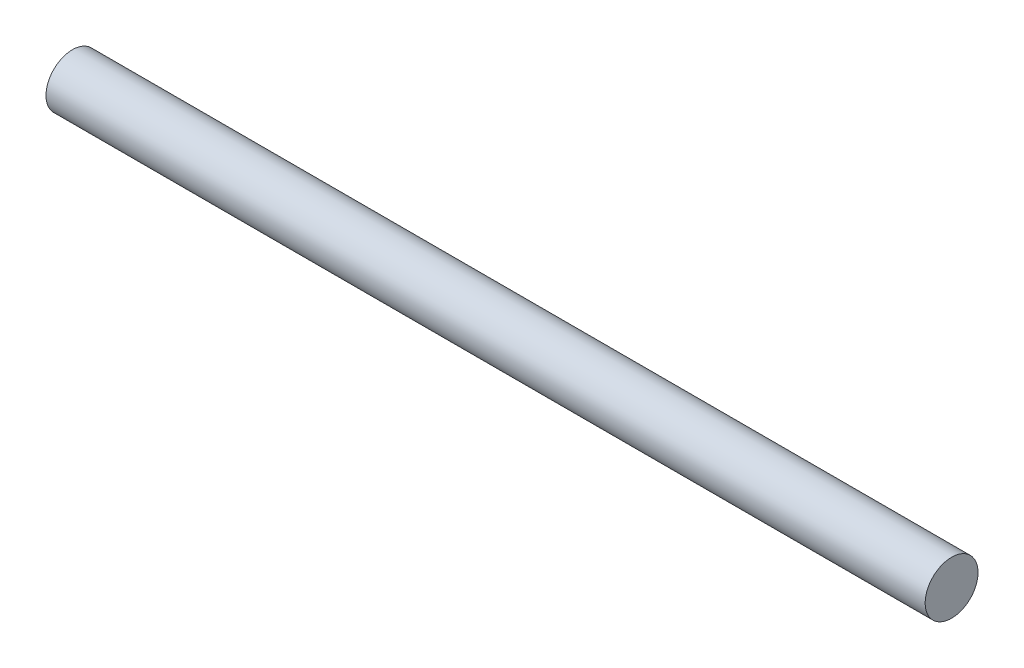
ISO-10303-21;
HEADER;
FILE_DESCRIPTION(('STEP AP214'),'2;1');
FILE_NAME('part.step','',(''),(''),'','','');
FILE_SCHEMA(('AUTOMOTIVE_DESIGN { 1 0 10303 214 1 1 1 1 }'));
ENDSEC;
DATA;
#1=APPLICATION_CONTEXT('core data for automotive mechanical design processes');
#2=APPLICATION_PROTOCOL_DEFINITION('international standard','automotive_design',2000,#1);
#3=PRODUCT_CONTEXT('',#1,'mechanical');
#4=PRODUCT('Part','Part','',(#3));
#5=PRODUCT_RELATED_PRODUCT_CATEGORY('part','',(#4));
#6=PRODUCT_DEFINITION_FORMATION('','',#4);
#7=PRODUCT_DEFINITION_CONTEXT('part definition',#1,'design');
#8=PRODUCT_DEFINITION('design','',#6,#7);
#9=PRODUCT_DEFINITION_SHAPE('','',#8);
#10=(LENGTH_UNIT() NAMED_UNIT(*) SI_UNIT(.MILLI.,.METRE.));
#11=(NAMED_UNIT(*) PLANE_ANGLE_UNIT() SI_UNIT($,.RADIAN.));
#12=(NAMED_UNIT(*) SI_UNIT($,.STERADIAN.) SOLID_ANGLE_UNIT());
#13=UNCERTAINTY_MEASURE_WITH_UNIT(LENGTH_MEASURE(1.E-05),#10,'distance_accuracy_value','');
#14=(GEOMETRIC_REPRESENTATION_CONTEXT(3) GLOBAL_UNCERTAINTY_ASSIGNED_CONTEXT((#13)) GLOBAL_UNIT_ASSIGNED_CONTEXT((#10,
#11,#12)) REPRESENTATION_CONTEXT('',''));
#15=CARTESIAN_POINT('',(0.,0.,0.));
#16=DIRECTION('',(0.,0.,1.));
#17=DIRECTION('',(1.,0.,0.));
#18=AXIS2_PLACEMENT_3D('',#15,#16,#17);
#19=CARTESIAN_POINT('',(-213.489347611488,322.361927831196,-613.95));
#20=DIRECTION('',(0.,-1.,0.));
#21=DIRECTION('',(0.,0.,-1.));
#22=AXIS2_PLACEMENT_3D('',#19,#20,#21);
#23=CONICAL_SURFACE('',#22,5.09999999995869,1.02974425865526);
#24=CARTESIAN_POINT('',(-213.489347611488,325.426316988228,-613.949999999988));
#25=VERTEX_POINT('',#24);
#26=VERTEX_LOOP('',#25);
#27=FACE_BOUND('',#26,.T.);
#28=CARTESIAN_POINT('',(-213.489347611488,322.361927831158,-613.95));
#29=DIRECTION('',(0.,-1.,0.));
#30=DIRECTION('',(0.,0.,-1.));
#31=AXIS2_PLACEMENT_3D('',#28,#29,#30);
#32=CIRCLE('',#31,5.1);
#33=CARTESIAN_POINT('',(-213.489347611488,322.361927831158,-619.05));
#34=VERTEX_POINT('',#33);
#35=EDGE_CURVE('E41',#34,#34,#32,.T.);
#36=ORIENTED_EDGE('',*,*,#35,.T.);
#37=EDGE_LOOP('',(#36));
#38=FACE_BOUND('',#37,.T.);
#39=ADVANCED_FACE('F17',(#27,#38),#23,.F.);
#40=CARTESIAN_POINT('',(-133.489347611488,322.361927831196,-613.95));
#41=DIRECTION('',(0.,-1.,0.));
#42=DIRECTION('',(0.,0.,-1.));
#43=AXIS2_PLACEMENT_3D('',#40,#41,#42);
#44=CONICAL_SURFACE('',#43,5.09999999995869,1.02974425865526);
#45=CARTESIAN_POINT('',(-133.489347611488,325.426316988228,-613.949999999988));
#46=VERTEX_POINT('',#45);
#47=VERTEX_LOOP('',#46);
#48=FACE_BOUND('',#47,.T.);
#49=CARTESIAN_POINT('',(-133.489347611488,322.361927831158,-613.95));
#50=DIRECTION('',(0.,-1.,0.));
#51=DIRECTION('',(0.,0.,-1.));
#52=AXIS2_PLACEMENT_3D('',#49,#50,#51);
#53=CIRCLE('',#52,5.1);
#54=CARTESIAN_POINT('',(-133.489347611488,322.361927831158,-619.05));
#55=VERTEX_POINT('',#54);
#56=EDGE_CURVE('E43',#55,#55,#53,.T.);
#57=ORIENTED_EDGE('',*,*,#56,.T.);
#58=EDGE_LOOP('',(#57));
#59=FACE_BOUND('',#58,.T.);
#60=ADVANCED_FACE('F38',(#48,#59),#44,.F.);
#61=CARTESIAN_POINT('',(-213.489347611488,291.861927831158,-613.95));
#62=DIRECTION('',(0.,-1.,0.));
#63=DIRECTION('',(0.,0.,-1.));
#64=AXIS2_PLACEMENT_3D('',#61,#62,#63);
#65=CYLINDRICAL_SURFACE('',#64,5.1);
#66=ORIENTED_EDGE('',*,*,#35,.F.);
#67=EDGE_LOOP('',(#66));
#68=FACE_BOUND('',#67,.T.);
#69=CARTESIAN_POINT('',(-213.489347611488,292.220491410964,-608.85));
#70=CARTESIAN_POINT('',(-213.346939032654,292.220491132857,-608.850000743828));
#71=CARTESIAN_POINT('',(-213.204508703072,292.219646252261,-608.855969794335));
#72=CARTESIAN_POINT('',(-212.920611238575,292.21628976674,-608.879808186821));
#73=CARTESIAN_POINT('',(-212.779144591536,292.213777373007,-608.897683160847));
#74=CARTESIAN_POINT('',(-212.498007184461,292.207152713141,-608.945242217478));
#75=CARTESIAN_POINT('',(-212.358339745417,292.203037833321,-608.97494559425));
#76=CARTESIAN_POINT('',(-212.081982992976,292.193325522824,-609.045951960026));
#77=CARTESIAN_POINT('',(-211.945294828178,292.187727530935,-609.087259340373));
#78=CARTESIAN_POINT('',(-211.676120232044,292.175220486331,-609.18109127047));
#79=CARTESIAN_POINT('',(-211.543627738757,292.168313436248,-609.233598701283));
#80=CARTESIAN_POINT('',(-211.28350419562,292.153377069012,-609.349506844893));
#81=CARTESIAN_POINT('',(-211.155874960489,292.14534733805,-609.4129115763));
#82=CARTESIAN_POINT('',(-210.906510242832,292.128401865254,-609.550092518883));
#83=CARTESIAN_POINT('',(-210.78477024694,292.119486818431,-609.623860612961));
#84=CARTESIAN_POINT('',(-210.54786914658,292.101012845346,-609.781314281504));
#85=CARTESIAN_POINT('',(-210.432710504348,292.091453680984,-609.865003532164));
#86=CARTESIAN_POINT('',(-210.209141969366,292.071903656039,-610.04222318872));
#87=CARTESIAN_POINT('',(-210.100776507755,292.061910557492,-610.13580940354));
#88=CARTESIAN_POINT('',(-209.892260859676,292.041824475064,-610.331789616415));
#89=CARTESIAN_POINT('',(-209.792113728006,292.03173145559,-610.434186860865));
#90=CARTESIAN_POINT('',(-209.600800284167,292.011735683318,-610.647021206297));
#91=CARTESIAN_POINT('',(-209.509631606474,292.001832880959,-610.757456176199));
#92=CARTESIAN_POINT('',(-209.336851322405,291.982489227453,-610.985667732249));
#93=CARTESIAN_POINT('',(-209.255243253353,291.973048548033,-611.103447011172));
#94=CARTESIAN_POINT('',(-209.101911128928,291.954863966583,-611.345953589095));
#95=CARTESIAN_POINT('',(-209.030225676614,291.946122838783,-611.470705512243));
#96=CARTESIAN_POINT('',(-208.897600669893,291.929622058634,-611.725915639935));
#97=CARTESIAN_POINT('',(-208.836665120865,291.92186277242,-611.856375948905));
#98=CARTESIAN_POINT('',(-208.726043310313,291.907553644554,-612.121992662409));
#99=CARTESIAN_POINT('',(-208.676352362161,291.901003299239,-612.257147083294));
#100=CARTESIAN_POINT('',(-208.588544550413,291.889291336036,-612.531242014267));
#101=CARTESIAN_POINT('',(-208.550431988518,291.884130234373,-612.670183910669));
#102=CARTESIAN_POINT('',(-208.454402194121,291.871031353773,-613.089237433029));
#103=CARTESIAN_POINT('',(-208.413941369337,291.865364138892,-613.373629313614));
#104=CARTESIAN_POINT('',(-208.381323222481,291.86080808865,-613.945216162223));
#105=CARTESIAN_POINT('',(-208.389163630934,291.861918934816,-614.232410997915));
#106=CARTESIAN_POINT('',(-208.436703861206,291.868525544821,-614.657858308054));
#107=CARTESIAN_POINT('',(-208.458396166471,291.871534843425,-614.798371061319));
#108=CARTESIAN_POINT('',(-208.513413854514,291.879090861733,-615.077039928221));
#109=CARTESIAN_POINT('',(-208.546734885619,291.883637006303,-615.215196903176));
#110=CARTESIAN_POINT('',(-208.624783215857,291.894144586066,-615.488243290287));
#111=CARTESIAN_POINT('',(-208.669514961021,291.90010657286,-615.623131406293));
#112=CARTESIAN_POINT('',(-208.7700323976,291.913276052463,-615.888607513765));
#113=CARTESIAN_POINT('',(-208.825814124591,291.92048309846,-616.019197027912));
#114=CARTESIAN_POINT('',(-208.948267825548,291.935973441252,-616.275697144089));
#115=CARTESIAN_POINT('',(-209.014979511339,291.944260639235,-616.401588548499));
#116=CARTESIAN_POINT('',(-209.158642839636,291.961656520715,-616.647264889052));
#117=CARTESIAN_POINT('',(-209.235590798047,291.970764908283,-616.767052000814));
#118=CARTESIAN_POINT('',(-209.399231404228,291.989556080981,-616.999785564408));
#119=CARTESIAN_POINT('',(-209.485927274235,291.999239055544,-617.112729735163));
#120=CARTESIAN_POINT('',(-209.668407434396,292.018904432692,-617.330922344829));
#121=CARTESIAN_POINT('',(-209.764188447947,292.028886726446,-617.436173534188));
#122=CARTESIAN_POINT('',(-209.965083067759,292.048964721996,-617.639191087572));
#123=CARTESIAN_POINT('',(-210.070271027063,292.059060651633,-617.736883869296));
#124=CARTESIAN_POINT('',(-210.288479739446,292.078989449684,-617.923034648054));
#125=CARTESIAN_POINT('',(-210.401497623173,292.088822412653,-618.011495998564));
#126=CARTESIAN_POINT('',(-210.634712483843,292.107957941799,-618.178671108343));
#127=CARTESIAN_POINT('',(-210.754915348373,292.117260060441,-618.257376706554));
#128=CARTESIAN_POINT('',(-211.001529791299,292.135055739233,-618.404364220365));
#129=CARTESIAN_POINT('',(-211.127939019263,292.143549601954,-618.472650042435));
#130=CARTESIAN_POINT('',(-211.386355835781,292.159503010257,-618.598452913198));
#131=CARTESIAN_POINT('',(-211.518373178015,292.166960648692,-618.655950172163));
#132=CARTESIAN_POINT('',(-211.786803336076,292.180603984917,-618.759577154227));
#133=CARTESIAN_POINT('',(-211.923214444558,292.186790170038,-618.805711234023));
#134=CARTESIAN_POINT('',(-212.199266183141,292.197704204893,-618.886226175794));
#135=CARTESIAN_POINT('',(-212.338900972354,292.202434498973,-618.920626748179));
#136=CARTESIAN_POINT('',(-212.620563885835,292.210310275209,-618.977508515158));
#137=CARTESIAN_POINT('',(-212.76259081631,292.213456524999,-618.999995483405));
#138=CARTESIAN_POINT('',(-213.002215417039,292.217334274338,-619.027619938099));
#139=CARTESIAN_POINT('',(-213.099443210982,292.218516691242,-619.036009345952));
#140=CARTESIAN_POINT('',(-213.294226470552,292.220095355052,-619.047199633336));
#141=CARTESIAN_POINT('',(-213.391781936369,292.220491601498,-619.050000509605));
#142=CARTESIAN_POINT('',(-213.631756190322,292.220491132857,-619.049999256172));
#143=CARTESIAN_POINT('',(-213.774186519904,292.219646252261,-619.044030205665));
#144=CARTESIAN_POINT('',(-214.058083984401,292.21628976674,-619.020191813179));
#145=CARTESIAN_POINT('',(-214.19955063144,292.213777373007,-619.002316839153));
#146=CARTESIAN_POINT('',(-214.480688038515,292.207152713141,-618.954757782522));
#147=CARTESIAN_POINT('',(-214.620355477559,292.203037833321,-618.92505440575));
#148=CARTESIAN_POINT('',(-214.89671223,292.193325522824,-618.854048039974));
#149=CARTESIAN_POINT('',(-215.033400394798,292.187727530935,-618.812740659627));
#150=CARTESIAN_POINT('',(-215.302574990932,292.175220486331,-618.718908729531));
#151=CARTESIAN_POINT('',(-215.435067484219,292.168313436248,-618.666401298717));
#152=CARTESIAN_POINT('',(-215.695191027356,292.153377069012,-618.550493155107));
#153=CARTESIAN_POINT('',(-215.822820262487,292.14534733805,-618.4870884237));
#154=CARTESIAN_POINT('',(-216.072184980144,292.128401865254,-618.349907481117));
#155=CARTESIAN_POINT('',(-216.193924976036,292.119486818431,-618.276139387039));
#156=CARTESIAN_POINT('',(-216.430826076395,292.101012845346,-618.118685718496));
#157=CARTESIAN_POINT('',(-216.545984718628,292.091453680984,-618.034996467836));
#158=CARTESIAN_POINT('',(-216.76955325361,292.071903656039,-617.857776811281));
#159=CARTESIAN_POINT('',(-216.877918715221,292.061910557492,-617.76419059646));
#160=CARTESIAN_POINT('',(-217.0864343633,292.041824475064,-617.568210383585));
#161=CARTESIAN_POINT('',(-217.18658149497,292.03173145559,-617.465813139136));
#162=CARTESIAN_POINT('',(-217.377894938809,292.011735683318,-617.252978793704));
#163=CARTESIAN_POINT('',(-217.469063616502,292.001832880959,-617.142543823801));
#164=CARTESIAN_POINT('',(-217.641843900571,291.982489227453,-616.914332267752));
#165=CARTESIAN_POINT('',(-217.723451969623,291.973048548033,-616.796552988829));
#166=CARTESIAN_POINT('',(-217.876784094048,291.954863966583,-616.554046410905));
#167=CARTESIAN_POINT('',(-217.948469546362,291.946122838783,-616.429294487757));
#168=CARTESIAN_POINT('',(-218.081094553083,291.929622058634,-616.174084360065));
#169=CARTESIAN_POINT('',(-218.142030102111,291.92186277242,-616.043624051095));
#170=CARTESIAN_POINT('',(-218.252651912662,291.907553644554,-615.778007337592));
#171=CARTESIAN_POINT('',(-218.302342860815,291.901003299239,-615.642852916706));
#172=CARTESIAN_POINT('',(-218.390150672563,291.889291336036,-615.368757985734));
#173=CARTESIAN_POINT('',(-218.428263234458,291.884130234373,-615.229816089331));
#174=CARTESIAN_POINT('',(-218.524293028855,291.871031353773,-614.810762566971));
#175=CARTESIAN_POINT('',(-218.564753853639,291.865364138892,-614.526370686386));
#176=CARTESIAN_POINT('',(-218.597372000495,291.86080808865,-613.954783837777));
#177=CARTESIAN_POINT('',(-218.589531592042,291.861918934816,-613.667589002085));
#178=CARTESIAN_POINT('',(-218.54199136177,291.868525544821,-613.242141691946));
#179=CARTESIAN_POINT('',(-218.520299056505,291.871534843425,-613.101628938681));
#180=CARTESIAN_POINT('',(-218.465281368462,291.879090861733,-612.822960071779));
#181=CARTESIAN_POINT('',(-218.431960337357,291.883637006303,-612.684803096824));
#182=CARTESIAN_POINT('',(-218.353912007118,291.894144586066,-612.411756709713));
#183=CARTESIAN_POINT('',(-218.309180261955,291.90010657286,-612.276868593707));
#184=CARTESIAN_POINT('',(-218.208662825376,291.913276052463,-612.011392486235));
#185=CARTESIAN_POINT('',(-218.152881098385,291.92048309846,-611.880802972088));
#186=CARTESIAN_POINT('',(-218.030427397428,291.935973441252,-611.624302855912));
#187=CARTESIAN_POINT('',(-217.963715711637,291.944260639235,-611.498411451501));
#188=CARTESIAN_POINT('',(-217.82005238334,291.961656520715,-611.252735110948));
#189=CARTESIAN_POINT('',(-217.743104424929,291.970764908283,-611.132947999186));
#190=CARTESIAN_POINT('',(-217.579463818748,291.989556080981,-610.900214435592));
#191=CARTESIAN_POINT('',(-217.492767948741,291.999239055544,-610.787270264837));
#192=CARTESIAN_POINT('',(-217.310287788579,292.018904432692,-610.569077655171));
#193=CARTESIAN_POINT('',(-217.214506775029,292.028886726446,-610.463826465812));
#194=CARTESIAN_POINT('',(-217.013612155217,292.048964721996,-610.260808912429));
#195=CARTESIAN_POINT('',(-216.908424195913,292.059060651633,-610.163116130704));
#196=CARTESIAN_POINT('',(-216.69021548353,292.078989449684,-609.976965351946));
#197=CARTESIAN_POINT('',(-216.577197599803,292.088822412653,-609.888504001437));
#198=CARTESIAN_POINT('',(-216.343982739133,292.107957941799,-609.721328891657));
#199=CARTESIAN_POINT('',(-216.223779874603,292.117260060441,-609.642623293446));
#200=CARTESIAN_POINT('',(-215.977165431677,292.135055739233,-609.495635779635));
#201=CARTESIAN_POINT('',(-215.850756203713,292.143549601954,-609.427349957565));
#202=CARTESIAN_POINT('',(-215.592339387195,292.159503010257,-609.301547086802));
#203=CARTESIAN_POINT('',(-215.460322044961,292.166960648692,-609.244049827837));
#204=CARTESIAN_POINT('',(-215.1918918869,292.180603984917,-609.140422845773));
#205=CARTESIAN_POINT('',(-215.055480778418,292.186790170038,-609.094288765977));
#206=CARTESIAN_POINT('',(-214.779429039835,292.197704204893,-609.013773824206));
#207=CARTESIAN_POINT('',(-214.639794250622,292.202434498973,-608.979373251821));
#208=CARTESIAN_POINT('',(-214.358131337141,292.210310275209,-608.922491484843));
#209=CARTESIAN_POINT('',(-214.216104406666,292.213456524999,-608.900004516595));
#210=CARTESIAN_POINT('',(-213.976479805937,292.217334274338,-608.872380061901));
#211=CARTESIAN_POINT('',(-213.879252011994,292.218516691242,-608.863990654048));
#212=CARTESIAN_POINT('',(-213.684468752424,292.220095355052,-608.852800366664));
#213=CARTESIAN_POINT('',(-213.586913286607,292.220491601498,-608.849999490395));
#214=CARTESIAN_POINT('',(-213.489347611488,292.220491410964,-608.85));
#215=B_SPLINE_CURVE_WITH_KNOTS('',3,(#69,#70,#71,#72,#73,#74,#75,#76,#77,#78,#79,#80,#81,#82,
#83,#84,#85,#86,#87,#88,#89,#90,#91,#92,#93,#94,#95,#96,#97,#98,#99,#100,#101,#102,#103,#104,
#105,#106,#107,#108,#109,#110,#111,#112,#113,#114,#115,#116,#117,#118,#119,#120,#121,#122,#123,
#124,#125,#126,#127,#128,#129,#130,#131,#132,#133,#134,#135,#136,#137,#138,#139,#140,#141,#142,
#143,#144,#145,#146,#147,#148,#149,#150,#151,#152,#153,#154,#155,#156,#157,#158,#159,#160,#161,
#162,#163,#164,#165,#166,#167,#168,#169,#170,#171,#172,#173,#174,#175,#176,#177,#178,#179,#180,
#181,#182,#183,#184,#185,#186,#187,#188,#189,#190,#191,#192,#193,#194,#195,#196,#197,#198,#199,
#200,#201,#202,#203,#204,#205,#206,#207,#208,#209,#210,#211,#212,#213,#214),.UNSPECIFIED.,.T.,
.F.,(4,2,2,2,2,2,2,2,2,2,2,2,2,2,2,2,2,2,2,2,2,2,2,2,2,2,2,2,2,2,2,2,2,2,2,2,2,2,2,2,2,2,2,2,2,
2,2,2,2,2,2,2,2,2,2,2,2,2,2,2,2,2,2,2,2,2,2,2,2,2,2,2,4),(0.,0.427136161371791,
0.854474521361174,1.28251281813685,1.71071331761009,2.13826395644524,2.56597260326959,
2.99334809616757,3.42088244710927,3.85097111178886,4.2812189253329,4.7113530778857,
5.14164587622814,5.5735682723438,6.00565126296704,6.43755383296673,6.86961667138609,
7.72715389649607,8.58465082978418,9.01085835282005,9.43690655222022,9.86312100972958,
10.2891828294162,10.7168284617009,11.1443205960748,11.5719544585588,11.9994346748665,
12.4306567998146,12.861721726629,13.2931448563243,13.7244058420252,14.1564503280104,
14.5883289072863,15.0194783850151,15.4504187245196,15.7430542101705,16.0356898666263,
16.4628260279981,16.8901643879875,17.3182026847632,17.7464031842364,18.1739538230716,
18.6016624698959,19.0290379627939,19.4565723137356,19.8866609784152,20.3169087919593,
20.7470429445121,21.1773357428545,21.6092581389703,22.0413411295934,22.4732436995929,
22.9053065380124,23.7628437631225,24.6203406964105,25.0465482194465,25.4725964188467,
25.8988108763562,26.3248726960426,26.7525183283274,27.1800104627013,27.6076443251854,
28.0351245414928,28.4663466664409,28.8974115932553,29.3288347229506,29.7600957086515,
30.1921401946368,30.6240187739128,31.0551682516415,31.486108591146,31.7787440767968,
32.0713797332527),.UNSPECIFIED.);
#216=CARTESIAN_POINT('',(-213.489347611488,292.220491410964,-608.85));
#217=VERTEX_POINT('',#216);
#218=EDGE_CURVE('E20',#217,#217,#215,.T.);
#219=ORIENTED_EDGE('',*,*,#218,.F.);
#220=EDGE_LOOP('',(#219));
#221=FACE_BOUND('',#220,.T.);
#222=ADVANCED_FACE('F73',(#68,#221),#65,.F.);
#223=CARTESIAN_POINT('',(-133.489347611488,291.861927831158,-613.95));
#224=DIRECTION('',(0.,-1.,0.));
#225=DIRECTION('',(0.,0.,-1.));
#226=AXIS2_PLACEMENT_3D('',#223,#224,#225);
#227=CYLINDRICAL_SURFACE('',#226,5.1);
#228=ORIENTED_EDGE('',*,*,#56,.F.);
#229=EDGE_LOOP('',(#228));
#230=FACE_BOUND('',#229,.T.);
#231=CARTESIAN_POINT('',(-133.489347611488,292.220491410964,-608.85));
#232=CARTESIAN_POINT('',(-133.346939032654,292.220491132857,-608.850000743828));
#233=CARTESIAN_POINT('',(-133.204508703072,292.219646252261,-608.855969794335));
#234=CARTESIAN_POINT('',(-132.920611238575,292.21628976674,-608.879808186821));
#235=CARTESIAN_POINT('',(-132.779144591536,292.213777373007,-608.897683160847));
#236=CARTESIAN_POINT('',(-132.498007184461,292.207152713141,-608.945242217478));
#237=CARTESIAN_POINT('',(-132.358339745417,292.203037833321,-608.97494559425));
#238=CARTESIAN_POINT('',(-132.081982992976,292.193325522824,-609.045951960026));
#239=CARTESIAN_POINT('',(-131.945294828178,292.187727530935,-609.087259340373));
#240=CARTESIAN_POINT('',(-131.676120232044,292.175220486331,-609.18109127047));
#241=CARTESIAN_POINT('',(-131.543627738757,292.168313436248,-609.233598701283));
#242=CARTESIAN_POINT('',(-131.28350419562,292.153377069012,-609.349506844893));
#243=CARTESIAN_POINT('',(-131.155874960489,292.14534733805,-609.4129115763));
#244=CARTESIAN_POINT('',(-130.906510242832,292.128401865254,-609.550092518883));
#245=CARTESIAN_POINT('',(-130.78477024694,292.119486818431,-609.623860612961));
#246=CARTESIAN_POINT('',(-130.54786914658,292.101012845346,-609.781314281504));
#247=CARTESIAN_POINT('',(-130.432710504347,292.091453680984,-609.865003532165));
#248=CARTESIAN_POINT('',(-130.209141969366,292.071903656039,-610.04222318872));
#249=CARTESIAN_POINT('',(-130.100776507755,292.061910557492,-610.13580940354));
#250=CARTESIAN_POINT('',(-129.892260859676,292.041824475064,-610.331789616415));
#251=CARTESIAN_POINT('',(-129.792113728006,292.03173145559,-610.434186860865));
#252=CARTESIAN_POINT('',(-129.600800284167,292.011735683318,-610.647021206297));
#253=CARTESIAN_POINT('',(-129.509631606474,292.001832880959,-610.757456176199));
#254=CARTESIAN_POINT('',(-129.336851322405,291.982489227453,-610.985667732249));
#255=CARTESIAN_POINT('',(-129.255243253353,291.973048548033,-611.103447011172));
#256=CARTESIAN_POINT('',(-129.101911128928,291.954863966583,-611.345953589095));
#257=CARTESIAN_POINT('',(-129.030225676614,291.946122838783,-611.470705512243));
#258=CARTESIAN_POINT('',(-128.897600669893,291.929622058634,-611.725915639935));
#259=CARTESIAN_POINT('',(-128.836665120865,291.92186277242,-611.856375948905));
#260=CARTESIAN_POINT('',(-128.726043310314,291.907553644554,-612.121992662409));
#261=CARTESIAN_POINT('',(-128.676352362161,291.901003299239,-612.257147083293));
#262=CARTESIAN_POINT('',(-128.588544550413,291.889291336036,-612.531242014267));
#263=CARTESIAN_POINT('',(-128.550431988518,291.884130234373,-612.670183910669));
#264=CARTESIAN_POINT('',(-128.454402194121,291.871031353773,-613.089237433029));
#265=CARTESIAN_POINT('',(-128.413941369337,291.865364138892,-613.373629313614));
#266=CARTESIAN_POINT('',(-128.381323222481,291.86080808865,-613.945216162223));
#267=CARTESIAN_POINT('',(-128.389163630934,291.861918934816,-614.232410997915));
#268=CARTESIAN_POINT('',(-128.436703861206,291.868525544821,-614.657858308054));
#269=CARTESIAN_POINT('',(-128.458396166471,291.871534843425,-614.798371061319));
#270=CARTESIAN_POINT('',(-128.513413854514,291.879090861733,-615.077039928221));
#271=CARTESIAN_POINT('',(-128.546734885619,291.883637006303,-615.215196903176));
#272=CARTESIAN_POINT('',(-128.624783215857,291.894144586066,-615.488243290287));
#273=CARTESIAN_POINT('',(-128.669514961021,291.90010657286,-615.623131406293));
#274=CARTESIAN_POINT('',(-128.7700323976,291.913276052463,-615.888607513765));
#275=CARTESIAN_POINT('',(-128.825814124591,291.92048309846,-616.019197027912));
#276=CARTESIAN_POINT('',(-128.948267825548,291.935973441252,-616.275697144089));
#277=CARTESIAN_POINT('',(-129.014979511339,291.944260639235,-616.401588548499));
#278=CARTESIAN_POINT('',(-129.158642839636,291.961656520715,-616.647264889052));
#279=CARTESIAN_POINT('',(-129.235590798047,291.970764908283,-616.767052000814));
#280=CARTESIAN_POINT('',(-129.399231404228,291.989556080981,-616.999785564408));
#281=CARTESIAN_POINT('',(-129.485927274235,291.999239055544,-617.112729735163));
#282=CARTESIAN_POINT('',(-129.668407434397,292.018904432692,-617.330922344829));
#283=CARTESIAN_POINT('',(-129.764188447947,292.028886726446,-617.436173534188));
#284=CARTESIAN_POINT('',(-129.965083067759,292.048964721996,-617.639191087572));
#285=CARTESIAN_POINT('',(-130.070271027063,292.059060651633,-617.736883869296));
#286=CARTESIAN_POINT('',(-130.288479739446,292.078989449684,-617.923034648054));
#287=CARTESIAN_POINT('',(-130.401497623172,292.088822412653,-618.011495998564));
#288=CARTESIAN_POINT('',(-130.634712483843,292.107957941799,-618.178671108343));
#289=CARTESIAN_POINT('',(-130.754915348373,292.117260060441,-618.257376706554));
#290=CARTESIAN_POINT('',(-131.001529791299,292.135055739233,-618.404364220365));
#291=CARTESIAN_POINT('',(-131.127939019263,292.143549601954,-618.472650042435));
#292=CARTESIAN_POINT('',(-131.386355835782,292.159503010257,-618.598452913198));
#293=CARTESIAN_POINT('',(-131.518373178015,292.166960648692,-618.655950172163));
#294=CARTESIAN_POINT('',(-131.786803336076,292.180603984917,-618.759577154227));
#295=CARTESIAN_POINT('',(-131.923214444558,292.186790170038,-618.805711234023));
#296=CARTESIAN_POINT('',(-132.199266183141,292.197704204893,-618.886226175794));
#297=CARTESIAN_POINT('',(-132.338900972354,292.202434498973,-618.920626748179));
#298=CARTESIAN_POINT('',(-132.620563885835,292.210310275209,-618.977508515158));
#299=CARTESIAN_POINT('',(-132.76259081631,292.213456524999,-618.999995483405));
#300=CARTESIAN_POINT('',(-133.002215417039,292.217334274338,-619.027619938099));
#301=CARTESIAN_POINT('',(-133.099443210982,292.218516691242,-619.036009345952));
#302=CARTESIAN_POINT('',(-133.294226470552,292.220095355052,-619.047199633336));
#303=CARTESIAN_POINT('',(-133.391781936369,292.220491601498,-619.050000509605));
#304=CARTESIAN_POINT('',(-133.631756190322,292.220491132857,-619.049999256172));
#305=CARTESIAN_POINT('',(-133.774186519904,292.219646252261,-619.044030205665));
#306=CARTESIAN_POINT('',(-134.058083984401,292.21628976674,-619.020191813179));
#307=CARTESIAN_POINT('',(-134.19955063144,292.213777373007,-619.002316839153));
#308=CARTESIAN_POINT('',(-134.480688038516,292.207152713141,-618.954757782522));
#309=CARTESIAN_POINT('',(-134.620355477559,292.203037833321,-618.92505440575));
#310=CARTESIAN_POINT('',(-134.89671223,292.193325522824,-618.854048039974));
#311=CARTESIAN_POINT('',(-135.033400394798,292.187727530935,-618.812740659627));
#312=CARTESIAN_POINT('',(-135.302574990932,292.175220486331,-618.718908729531));
#313=CARTESIAN_POINT('',(-135.435067484219,292.168313436248,-618.666401298717));
#314=CARTESIAN_POINT('',(-135.695191027356,292.153377069012,-618.550493155107));
#315=CARTESIAN_POINT('',(-135.822820262488,292.14534733805,-618.4870884237));
#316=CARTESIAN_POINT('',(-136.072184980144,292.128401865254,-618.349907481117));
#317=CARTESIAN_POINT('',(-136.193924976036,292.119486818431,-618.276139387039));
#318=CARTESIAN_POINT('',(-136.430826076396,292.101012845346,-618.118685718496));
#319=CARTESIAN_POINT('',(-136.545984718629,292.091453680984,-618.034996467836));
#320=CARTESIAN_POINT('',(-136.76955325361,292.071903656039,-617.85777681128));
#321=CARTESIAN_POINT('',(-136.877918715221,292.061910557492,-617.76419059646));
#322=CARTESIAN_POINT('',(-137.0864343633,292.041824475064,-617.568210383585));
#323=CARTESIAN_POINT('',(-137.18658149497,292.03173145559,-617.465813139136));
#324=CARTESIAN_POINT('',(-137.377894938809,292.011735683318,-617.252978793704));
#325=CARTESIAN_POINT('',(-137.469063616502,292.001832880959,-617.142543823801));
#326=CARTESIAN_POINT('',(-137.641843900571,291.982489227453,-616.914332267752));
#327=CARTESIAN_POINT('',(-137.723451969623,291.973048548033,-616.796552988829));
#328=CARTESIAN_POINT('',(-137.876784094048,291.954863966583,-616.554046410905));
#329=CARTESIAN_POINT('',(-137.948469546362,291.946122838783,-616.429294487757));
#330=CARTESIAN_POINT('',(-138.081094553083,291.929622058634,-616.174084360065));
#331=CARTESIAN_POINT('',(-138.142030102111,291.92186277242,-616.043624051095));
#332=CARTESIAN_POINT('',(-138.252651912662,291.907553644554,-615.778007337592));
#333=CARTESIAN_POINT('',(-138.302342860815,291.901003299239,-615.642852916706));
#334=CARTESIAN_POINT('',(-138.390150672563,291.889291336036,-615.368757985734));
#335=CARTESIAN_POINT('',(-138.428263234458,291.884130234373,-615.229816089331));
#336=CARTESIAN_POINT('',(-138.524293028855,291.871031353773,-614.810762566971));
#337=CARTESIAN_POINT('',(-138.564753853639,291.865364138892,-614.526370686386));
#338=CARTESIAN_POINT('',(-138.597372000495,291.86080808865,-613.954783837777));
#339=CARTESIAN_POINT('',(-138.589531592042,291.861918934816,-613.667589002085));
#340=CARTESIAN_POINT('',(-138.54199136177,291.868525544821,-613.242141691946));
#341=CARTESIAN_POINT('',(-138.520299056505,291.871534843425,-613.101628938681));
#342=CARTESIAN_POINT('',(-138.465281368462,291.879090861733,-612.822960071779));
#343=CARTESIAN_POINT('',(-138.431960337357,291.883637006303,-612.684803096824));
#344=CARTESIAN_POINT('',(-138.353912007119,291.894144586066,-612.411756709713));
#345=CARTESIAN_POINT('',(-138.309180261955,291.90010657286,-612.276868593707));
#346=CARTESIAN_POINT('',(-138.208662825376,291.913276052463,-612.011392486235));
#347=CARTESIAN_POINT('',(-138.152881098385,291.92048309846,-611.880802972089));
#348=CARTESIAN_POINT('',(-138.030427397428,291.935973441252,-611.624302855912));
#349=CARTESIAN_POINT('',(-137.963715711637,291.944260639235,-611.498411451501));
#350=CARTESIAN_POINT('',(-137.82005238334,291.961656520715,-611.252735110948));
#351=CARTESIAN_POINT('',(-137.743104424929,291.970764908283,-611.132947999186));
#352=CARTESIAN_POINT('',(-137.579463818748,291.989556080981,-610.900214435592));
#353=CARTESIAN_POINT('',(-137.492767948741,291.999239055544,-610.787270264837));
#354=CARTESIAN_POINT('',(-137.310287788579,292.018904432692,-610.569077655171));
#355=CARTESIAN_POINT('',(-137.214506775029,292.028886726446,-610.463826465812));
#356=CARTESIAN_POINT('',(-137.013612155217,292.048964721996,-610.260808912429));
#357=CARTESIAN_POINT('',(-136.908424195913,292.059060651633,-610.163116130704));
#358=CARTESIAN_POINT('',(-136.69021548353,292.078989449684,-609.976965351946));
#359=CARTESIAN_POINT('',(-136.577197599803,292.088822412653,-609.888504001437));
#360=CARTESIAN_POINT('',(-136.343982739133,292.107957941799,-609.721328891657));
#361=CARTESIAN_POINT('',(-136.223779874603,292.117260060441,-609.642623293446));
#362=CARTESIAN_POINT('',(-135.977165431677,292.135055739233,-609.495635779635));
#363=CARTESIAN_POINT('',(-135.850756203713,292.143549601954,-609.427349957565));
#364=CARTESIAN_POINT('',(-135.592339387194,292.159503010257,-609.301547086802));
#365=CARTESIAN_POINT('',(-135.460322044961,292.166960648692,-609.244049827837));
#366=CARTESIAN_POINT('',(-135.1918918869,292.180603984917,-609.140422845773));
#367=CARTESIAN_POINT('',(-135.055480778418,292.186790170038,-609.094288765977));
#368=CARTESIAN_POINT('',(-134.779429039835,292.197704204893,-609.013773824206));
#369=CARTESIAN_POINT('',(-134.639794250622,292.202434498973,-608.979373251821));
#370=CARTESIAN_POINT('',(-134.358131337141,292.210310275209,-608.922491484843));
#371=CARTESIAN_POINT('',(-134.216104406666,292.213456524999,-608.900004516595));
#372=CARTESIAN_POINT('',(-133.976479805937,292.217334274338,-608.872380061901));
#373=CARTESIAN_POINT('',(-133.879252011994,292.218516691242,-608.863990654048));
#374=CARTESIAN_POINT('',(-133.684468752424,292.220095355052,-608.852800366664));
#375=CARTESIAN_POINT('',(-133.586913286607,292.220491601498,-608.849999490395));
#376=CARTESIAN_POINT('',(-133.489347611488,292.220491410964,-608.85));
#377=B_SPLINE_CURVE_WITH_KNOTS('',3,(#231,#232,#233,#234,#235,#236,#237,#238,#239,#240,#241,
#242,#243,#244,#245,#246,#247,#248,#249,#250,#251,#252,#253,#254,#255,#256,#257,#258,#259,#260,
#261,#262,#263,#264,#265,#266,#267,#268,#269,#270,#271,#272,#273,#274,#275,#276,#277,#278,#279,
#280,#281,#282,#283,#284,#285,#286,#287,#288,#289,#290,#291,#292,#293,#294,#295,#296,#297,#298,
#299,#300,#301,#302,#303,#304,#305,#306,#307,#308,#309,#310,#311,#312,#313,#314,#315,#316,#317,
#318,#319,#320,#321,#322,#323,#324,#325,#326,#327,#328,#329,#330,#331,#332,#333,#334,#335,#336,
#337,#338,#339,#340,#341,#342,#343,#344,#345,#346,#347,#348,#349,#350,#351,#352,#353,#354,#355,
#356,#357,#358,#359,#360,#361,#362,#363,#364,#365,#366,#367,#368,#369,#370,#371,#372,#373,#374,
#375,#376),.UNSPECIFIED.,.T.,.F.,(4,2,2,2,2,2,2,2,2,2,2,2,2,2,2,2,2,2,2,2,2,2,2,2,2,2,2,2,2,2,2,
2,2,2,2,2,2,2,2,2,2,2,2,2,2,2,2,2,2,2,2,2,2,2,2,2,2,2,2,2,2,2,2,2,2,2,2,2,2,2,2,2,4),(0.,
0.427136161371791,0.854474521361174,1.28251281813688,1.71071331761012,2.13826395644532,
2.56597260326971,2.9933480961677,3.42088244710937,3.85097111178887,4.28121892533293,
4.71135307788574,5.14164587622816,5.57356827234381,6.00565126296694,6.43755383296639,
6.8696166713861,7.72715389649619,8.5846508297842,9.01085835282007,9.43690655222024,
9.8631210097296,10.2891828294163,10.7168284617009,11.1443205960748,11.5719544585588,
11.9994346748665,12.4306567998146,12.8617217266288,13.2931448563242,13.7244058420252,
14.1564503280105,14.5883289072865,15.0194783850152,15.4504187245197,15.7430542101705,
16.0356898666263,16.4628260279982,16.8901643879876,17.3182026847633,17.7464031842365,
18.1739538230717,18.6016624698961,19.029037962794,19.4565723137357,19.8866609784152,
20.3169087919593,20.747042944512,21.1773357428545,21.6092581389703,22.0413411295934,
22.4732436995929,22.9053065380124,23.7628437631225,24.6203406964105,25.0465482194464,
25.4725964188467,25.8988108763559,26.3248726960426,26.7525183283274,27.1800104627013,
27.6076443251853,28.0351245414928,28.4663466664409,28.8974115932553,29.3288347229506,
29.7600957086515,30.1921401946368,30.6240187739128,31.0551682516415,31.486108591146,
31.7787440767968,32.0713797332526),.UNSPECIFIED.);
#378=CARTESIAN_POINT('',(-133.489347611488,292.220491410964,-608.85));
#379=VERTEX_POINT('',#378);
#380=EDGE_CURVE('E49',#379,#379,#377,.T.);
#381=ORIENTED_EDGE('',*,*,#380,.F.);
#382=EDGE_LOOP('',(#381));
#383=FACE_BOUND('',#382,.T.);
#384=ADVANCED_FACE('F54',(#230,#383),#227,.F.);
#385=CARTESIAN_POINT('',(-779.039347611489,377.335927831157,-617.65));
#386=DIRECTION('',(-1.,0.,0.));
#387=DIRECTION('',(0.,0.,1.));
#388=AXIS2_PLACEMENT_3D('',#385,#386,#387);
#389=PLANE('',#388);
#390=CARTESIAN_POINT('',(-779.039347611489,328.310927831157,-613.95));
#391=DIRECTION('',(-1.,0.,0.));
#392=DIRECTION('',(0.,0.,1.));
#393=AXIS2_PLACEMENT_3D('',#390,#391,#392);
#394=CIRCLE('',#393,36.449);
#395=CARTESIAN_POINT('',(-779.039347611489,328.310927831157,-577.501));
#396=VERTEX_POINT('',#395);
#397=EDGE_CURVE('E30',#396,#396,#394,.F.);
#398=ORIENTED_EDGE('',*,*,#397,.F.);
#399=EDGE_LOOP('',(#398));
#400=FACE_BOUND('',#399,.T.);
#401=ADVANCED_FACE('F65',(#400),#389,.T.);
#402=CARTESIAN_POINT('',(432.060652388511,377.335927831157,-617.65));
#403=DIRECTION('',(-1.,0.,0.));
#404=DIRECTION('',(0.,0.,1.));
#405=AXIS2_PLACEMENT_3D('',#402,#403,#404);
#406=PLANE('',#405);
#407=CARTESIAN_POINT('',(432.060652388511,328.310927831157,-613.95));
#408=DIRECTION('',(-1.,0.,0.));
#409=DIRECTION('',(0.,0.,1.));
#410=AXIS2_PLACEMENT_3D('',#407,#408,#409);
#411=CIRCLE('',#410,36.449);
#412=CARTESIAN_POINT('',(432.060652388511,328.310927831157,-577.501));
#413=VERTEX_POINT('',#412);
#414=EDGE_CURVE('E11',#413,#413,#411,.T.);
#415=ORIENTED_EDGE('',*,*,#414,.F.);
#416=EDGE_LOOP('',(#415));
#417=FACE_BOUND('',#416,.T.);
#418=ADVANCED_FACE('F61',(#417),#406,.F.);
#419=CARTESIAN_POINT('',(432.060652388511,328.310927831157,-613.95));
#420=DIRECTION('',(-1.,0.,0.));
#421=DIRECTION('',(0.,0.,1.));
#422=AXIS2_PLACEMENT_3D('',#419,#420,#421);
#423=CYLINDRICAL_SURFACE('',#422,36.449);
#424=ORIENTED_EDGE('',*,*,#414,.T.);
#425=EDGE_LOOP('',(#424));
#426=FACE_BOUND('',#425,.T.);
#427=ORIENTED_EDGE('',*,*,#397,.T.);
#428=EDGE_LOOP('',(#427));
#429=FACE_BOUND('',#428,.T.);
#430=ORIENTED_EDGE('',*,*,#380,.T.);
#431=EDGE_LOOP('',(#430));
#432=FACE_BOUND('',#431,.T.);
#433=ORIENTED_EDGE('',*,*,#218,.T.);
#434=EDGE_LOOP('',(#433));
#435=FACE_BOUND('',#434,.T.);
#436=ADVANCED_FACE('F57',(#426,#429,#432,#435),#423,.T.);
#437=CLOSED_SHELL('',(#39,#60,#222,#384,#401,#418,#436));
#438=MANIFOLD_SOLID_BREP('B1',#437);
#439=ADVANCED_BREP_SHAPE_REPRESENTATION('',(#18,#438),#14);
#440=SHAPE_DEFINITION_REPRESENTATION(#9,#439);
ENDSEC;
END-ISO-10303-21;
